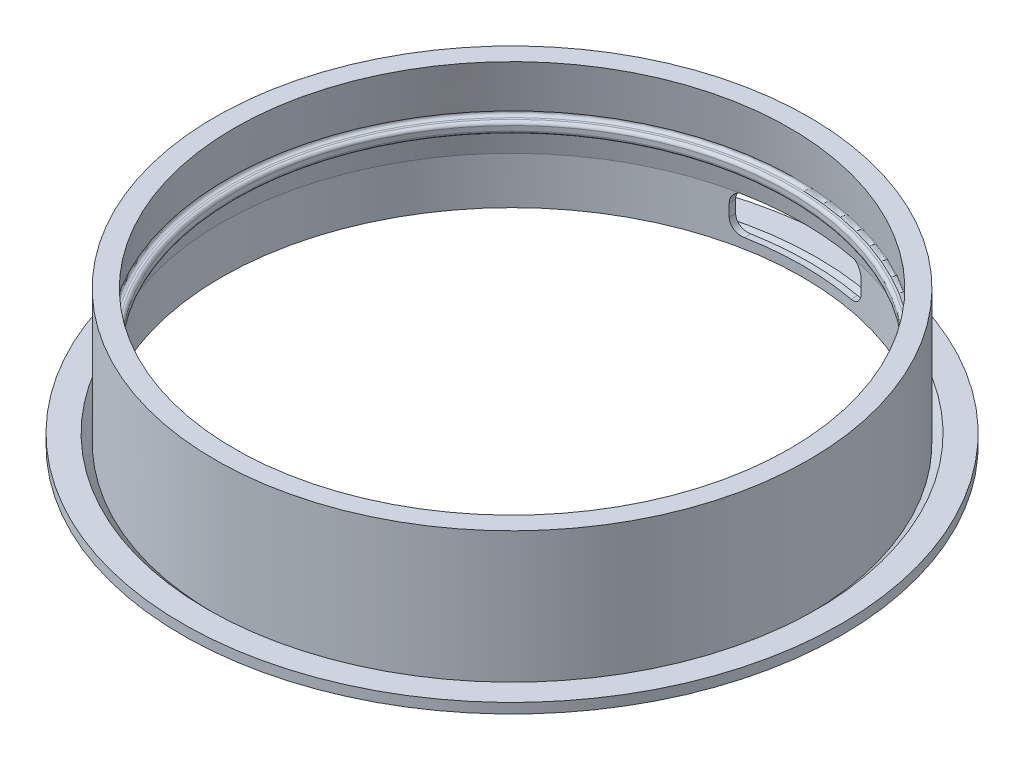
ISO-10303-21;
HEADER;
FILE_DESCRIPTION(('STEP AP214'),'2;1');
FILE_NAME('part.step','',(''),(''),'','','');
FILE_SCHEMA(('AUTOMOTIVE_DESIGN { 1 0 10303 214 1 1 1 1 }'));
ENDSEC;
DATA;
#1=APPLICATION_CONTEXT('core data for automotive mechanical design processes');
#2=APPLICATION_PROTOCOL_DEFINITION('international standard','automotive_design',2000,#1);
#3=PRODUCT_CONTEXT('',#1,'mechanical');
#4=PRODUCT('Part','Part','',(#3));
#5=PRODUCT_RELATED_PRODUCT_CATEGORY('part','',(#4));
#6=PRODUCT_DEFINITION_FORMATION('','',#4);
#7=PRODUCT_DEFINITION_CONTEXT('part definition',#1,'design');
#8=PRODUCT_DEFINITION('design','',#6,#7);
#9=PRODUCT_DEFINITION_SHAPE('','',#8);
#10=(LENGTH_UNIT() NAMED_UNIT(*) SI_UNIT(.MILLI.,.METRE.));
#11=(NAMED_UNIT(*) PLANE_ANGLE_UNIT() SI_UNIT($,.RADIAN.));
#12=(NAMED_UNIT(*) SI_UNIT($,.STERADIAN.) SOLID_ANGLE_UNIT());
#13=UNCERTAINTY_MEASURE_WITH_UNIT(LENGTH_MEASURE(1.E-05),#10,'distance_accuracy_value','');
#14=(GEOMETRIC_REPRESENTATION_CONTEXT(3) GLOBAL_UNCERTAINTY_ASSIGNED_CONTEXT((#13)) GLOBAL_UNIT_ASSIGNED_CONTEXT((#10,
#11,#12)) REPRESENTATION_CONTEXT('',''));
#15=CARTESIAN_POINT('',(0.,0.,0.));
#16=DIRECTION('',(0.,0.,1.));
#17=DIRECTION('',(1.,0.,0.));
#18=AXIS2_PLACEMENT_3D('',#15,#16,#17);
#19=CARTESIAN_POINT('',(47.3,1.59999999999999,0.));
#20=DIRECTION('',(0.,1.,0.));
#21=DIRECTION('',(-1.,0.,0.));
#22=AXIS2_PLACEMENT_3D('',#19,#20,#21);
#23=PLANE('',#22);
#24=DIRECTION('',(0.,0.,1.));
#25=VECTOR('',#24,1.);
#26=CARTESIAN_POINT('',(8.50000000000001,1.59999999999986,0.));
#27=LINE('',#26,#25);
#28=CARTESIAN_POINT('',(8.50000000000001,1.60000000000005,-45.5130750444309));
#29=VERTEX_POINT('',#28);
#30=CARTESIAN_POINT('',(8.50000000000001,1.59999999999985,-46.5299903288191));
#31=VERTEX_POINT('',#30);
#32=EDGE_CURVE('E113',#29,#31,#27,.F.);
#33=ORIENTED_EDGE('',*,*,#32,.T.);
#34=CARTESIAN_POINT('',(0.,1.6,0.));
#35=DIRECTION('',(0.,-1.,0.));
#36=DIRECTION('',(0.,0.,-1.));
#37=AXIS2_PLACEMENT_3D('',#34,#35,#36);
#38=CIRCLE('',#37,47.3000000000001);
#39=CARTESIAN_POINT('',(-8.5,1.6,-46.5299903288192));
#40=VERTEX_POINT('',#39);
#41=EDGE_CURVE('E106',#40,#31,#38,.T.);
#42=ORIENTED_EDGE('',*,*,#41,.F.);
#43=DIRECTION('',(0.,0.,1.));
#44=VECTOR('',#43,1.);
#45=CARTESIAN_POINT('',(-8.49999999999999,1.5999999999998,0.));
#46=LINE('',#45,#44);
#47=CARTESIAN_POINT('',(-8.49999999999999,1.60000000000005,-45.513075044431));
#48=VERTEX_POINT('',#47);
#49=EDGE_CURVE('E110',#40,#48,#46,.T.);
#50=ORIENTED_EDGE('',*,*,#49,.T.);
#51=CARTESIAN_POINT('',(0.,1.60000000000005,0.));
#52=DIRECTION('',(0.,-1.,0.));
#53=DIRECTION('',(1.,0.,0.));
#54=AXIS2_PLACEMENT_3D('',#51,#52,#53);
#55=CIRCLE('',#54,46.3);
#56=EDGE_CURVE('E511',#29,#48,#55,.F.);
#57=ORIENTED_EDGE('',*,*,#56,.F.);
#58=EDGE_LOOP('',(#33,#42,#50,#57));
#59=FACE_BOUND('',#58,.T.);
#60=ADVANCED_FACE('F35',(#59),#23,.T.);
#61=CARTESIAN_POINT('',(3.43024899888577E-12,-1000.,0.));
#62=DIRECTION('',(0.,-1.,0.));
#63=DIRECTION('',(1.,0.,0.));
#64=AXIS2_PLACEMENT_3D('',#61,#62,#63);
#65=CYLINDRICAL_SURFACE('',#64,46.3);
#66=CARTESIAN_POINT('',(0.,-1.11022302462516E-13,0.));
#67=DIRECTION('',(0.,-1.,0.));
#68=DIRECTION('',(1.,0.,0.));
#69=AXIS2_PLACEMENT_3D('',#66,#67,#68);
#70=CIRCLE('',#69,46.3);
#71=CARTESIAN_POINT('',(46.3,0.,0.));
#72=VERTEX_POINT('',#71);
#73=EDGE_CURVE('E531',#72,#72,#70,.T.);
#74=ORIENTED_EDGE('',*,*,#73,.T.);
#75=EDGE_LOOP('',(#74));
#76=FACE_BOUND('',#75,.T.);
#77=CARTESIAN_POINT('',(-10.5,5.6,-45.0936802667506));
#78=CARTESIAN_POINT('',(-10.5000004104109,5.65526649087846,-45.0936795736649));
#79=CARTESIAN_POINT('',(-10.4977077190256,5.7105060555035,-45.094214086322));
#80=CARTESIAN_POINT('',(-10.4885664548555,5.82058035333635,-45.0963413854431));
#81=CARTESIAN_POINT('',(-10.4817183802295,5.87541513014727,-45.097934056191));
#82=CARTESIAN_POINT('',(-10.4544303376453,6.03853785024145,-45.1042709372307));
#83=CARTESIAN_POINT('',(-10.4272462049723,6.14571769373603,-45.1105741435007));
#84=CARTESIAN_POINT('',(-10.3557605619696,6.35384369708262,-45.1270379133283));
#85=CARTESIAN_POINT('',(-10.3114559281232,6.45478871553405,-45.1371991807563));
#86=CARTESIAN_POINT('',(-10.2071093088741,6.64776185478804,-45.1609097744737));
#87=CARTESIAN_POINT('',(-10.1470663151222,6.73978940373497,-45.1744593178456));
#88=CARTESIAN_POINT('',(-10.0121874072757,6.91359965426659,-45.2045453775855));
#89=CARTESIAN_POINT('',(-9.93717567467599,6.99523964337688,-45.2211171715226));
#90=CARTESIAN_POINT('',(-9.77499612568789,7.14484949242155,-45.2564506721741));
#91=CARTESIAN_POINT('',(-9.6878251879712,7.21281583128583,-45.2752129409922));
#92=CARTESIAN_POINT('',(-9.50154931274933,7.33481710318538,-45.3146756268316));
#93=CARTESIAN_POINT('',(-9.40220982252247,7.38848218898965,-45.3354115307399));
#94=CARTESIAN_POINT('',(-9.19608906305918,7.4783203253953,-45.3776706493196));
#95=CARTESIAN_POINT('',(-9.08931057261664,7.51449986795624,-45.3991935685939));
#96=CARTESIAN_POINT('',(-8.90179675352576,7.5608950881171,-45.4362676883281));
#97=CARTESIAN_POINT('',(-8.82212520435228,7.57554152947498,-45.4518063776837));
#98=CARTESIAN_POINT('',(-8.66166009921809,7.59509466135875,-45.4826604171018));
#99=CARTESIAN_POINT('',(-8.58086809265328,7.60001366803208,-45.4979760251795));
#100=CARTESIAN_POINT('',(-8.5,7.6,-45.513075044431));
#101=B_SPLINE_CURVE_WITH_KNOTS('',3,(#77,#78,#79,#80,#81,#82,#83,#84,#85,#86,#87,#88,#89,#90,
#91,#92,#93,#94,#95,#96,#97,#98,#99,#100),.UNSPECIFIED.,.F.,.F.,(4,2,2,2,2,2,2,2,2,2,2,4),(0.,
0.165696119068076,0.331374121241239,0.661920187394013,0.992526587877508,1.32315417533432,
1.65792179006111,1.99277549999301,2.33559445459214,2.67828603083432,2.92518226759243,
3.17176570221575),.UNSPECIFIED.);
#102=CARTESIAN_POINT('',(-10.5000000000035,5.60000000000005,-45.0936802667506));
#103=VERTEX_POINT('',#102);
#104=CARTESIAN_POINT('',(-9.12449979983976,7.50000000000004,-45.3919982309958));
#105=VERTEX_POINT('',#104);
#106=EDGE_CURVE('E186',#103,#105,#101,.T.);
#107=ORIENTED_EDGE('',*,*,#106,.T.);
#108=CARTESIAN_POINT('',(0.,7.50000000000006,0.));
#109=DIRECTION('',(0.,-1.,0.));
#110=DIRECTION('',(1.,0.,0.));
#111=AXIS2_PLACEMENT_3D('',#108,#109,#110);
#112=CIRCLE('',#111,46.3000000000001);
#113=CARTESIAN_POINT('',(9.12449979983956,7.5000000000001,-45.3919982309959));
#114=VERTEX_POINT('',#113);
#115=EDGE_CURVE('E50',#114,#105,#112,.T.);
#116=ORIENTED_EDGE('',*,*,#115,.F.);
#117=CARTESIAN_POINT('',(8.5,7.6,-45.5130750444309));
#118=CARTESIAN_POINT('',(8.55725814141848,7.59999911370923,-45.5023821645604));
#119=CARTESIAN_POINT('',(8.61446784015599,7.59753969833357,-45.4915851243363));
#120=CARTESIAN_POINT('',(8.72843797955417,7.58773514770107,-45.4698551552103));
#121=CARTESIAN_POINT('',(8.78519844317114,7.58039026374855,-45.4589222333263));
#122=CARTESIAN_POINT('',(8.95413884527806,7.5510996006173,-45.4260553035093));
#123=CARTESIAN_POINT('',(9.0651294420343,7.52189762790166,-45.4040247761624));
#124=CARTESIAN_POINT('',(9.28058443687315,7.44493846832502,-45.3604769979874));
#125=CARTESIAN_POINT('',(9.38504575350412,7.39717259596863,-45.3389599924298));
#126=CARTESIAN_POINT('',(9.58445939191577,7.28435716649275,-45.2972241427976));
#127=CARTESIAN_POINT('',(9.679413830236,7.21931146825695,-45.2770050101357));
#128=CARTESIAN_POINT('',(9.85663852416251,7.07397782900395,-45.238754161388));
#129=CARTESIAN_POINT('',(9.93896207354822,6.99375730841239,-45.2207133271641));
#130=CARTESIAN_POINT('',(10.0889193713626,6.82003953795676,-45.1874940703667));
#131=CARTESIAN_POINT('',(10.1565512654013,6.72654061454467,-45.1723160091661));
#132=CARTESIAN_POINT('',(10.2737927715804,6.53082281538272,-45.1457942639334));
#133=CARTESIAN_POINT('',(10.3237204520179,6.42880341953919,-45.1343831933545));
#134=CARTESIAN_POINT('',(10.4056491521351,6.2175030499746,-45.1155654830007));
#135=CARTESIAN_POINT('',(10.4376671458512,6.10822906212921,-45.1081550518236));
#136=CARTESIAN_POINT('',(10.4734274796726,5.93171903273268,-45.099861350266));
#137=CARTESIAN_POINT('',(10.4833858570636,5.86574616555138,-45.0975464701491));
#138=CARTESIAN_POINT('',(10.4966703603771,5.73319306287905,-45.0944556223757));
#139=CARTESIAN_POINT('',(10.5000056555532,5.66661379546546,-45.0936775271423));
#140=CARTESIAN_POINT('',(10.5,5.60000000000004,-45.0936802667514));
#141=B_SPLINE_CURVE_WITH_KNOTS('',3,(#117,#118,#119,#120,#121,#122,#123,#124,#125,#126,#127,
#128,#129,#130,#131,#132,#133,#134,#135,#136,#137,#138,#139,#140),.UNSPECIFIED.,.F.,.F.,(4,2,2,
2,2,2,2,2,2,2,2,4),(0.,0.174635821586464,0.349262660750496,0.698059388238651,1.0470195041614,
1.39590175667445,1.74326889089933,2.09067984457726,2.43148863990916,2.77197388154683,
2.97193698786964,3.171623063917),.UNSPECIFIED.);
#142=CARTESIAN_POINT('',(10.4999999999968,5.60000000000005,-45.0936802667521));
#143=VERTEX_POINT('',#142);
#144=EDGE_CURVE('E540',#114,#143,#141,.T.);
#145=ORIENTED_EDGE('',*,*,#144,.T.);
#146=DIRECTION('',(0.,-1.,0.));
#147=VECTOR('',#146,1.);
#148=CARTESIAN_POINT('',(10.5000000000003,-1000.,-45.0936802667521));
#149=LINE('',#148,#147);
#150=CARTESIAN_POINT('',(10.4999999999968,3.59999999999983,-45.0936802667521));
#151=VERTEX_POINT('',#150);
#152=EDGE_CURVE('E513',#143,#151,#149,.T.);
#153=ORIENTED_EDGE('',*,*,#152,.T.);
#154=CARTESIAN_POINT('',(10.5,3.59999999999986,-45.0936802667521));
#155=CARTESIAN_POINT('',(10.5000004104109,3.54473350912139,-45.0936795736654));
#156=CARTESIAN_POINT('',(10.4977077190256,3.48949394449634,-45.0942140863221));
#157=CARTESIAN_POINT('',(10.4885664548555,3.37941964666348,-45.0963413854429));
#158=CARTESIAN_POINT('',(10.4817183802295,3.32458486985257,-45.0979340561909));
#159=CARTESIAN_POINT('',(10.4544303376453,3.16146214975839,-45.1042709372308));
#160=CARTESIAN_POINT('',(10.4272462049723,3.05428230626382,-45.1105741435007));
#161=CARTESIAN_POINT('',(10.3557605619696,2.84615630291723,-45.1270379133282));
#162=CARTESIAN_POINT('',(10.3114559281232,2.74521128446581,-45.1371991807563));
#163=CARTESIAN_POINT('',(10.2071093088741,2.55223814521182,-45.1609097744737));
#164=CARTESIAN_POINT('',(10.1470663151222,2.46021059626488,-45.1744593178456));
#165=CARTESIAN_POINT('',(10.0121874072757,2.28640034573326,-45.2045453775855));
#166=CARTESIAN_POINT('',(9.93717567467598,2.20476035662297,-45.2211171715226));
#167=CARTESIAN_POINT('',(9.77499612568787,2.0551505075783,-45.2564506721741));
#168=CARTESIAN_POINT('',(9.68782518797118,1.98718416871402,-45.2752129409922));
#169=CARTESIAN_POINT('',(9.50154931274931,1.86518289681447,-45.3146756268316));
#170=CARTESIAN_POINT('',(9.40220982252245,1.8115178110102,-45.3354115307399));
#171=CARTESIAN_POINT('',(9.19608906305917,1.72167967460456,-45.3776706493196));
#172=CARTESIAN_POINT('',(9.08931057261662,1.68550013204362,-45.3991935685939));
#173=CARTESIAN_POINT('',(8.90179675352575,1.63910491188277,-45.4362676883281));
#174=CARTESIAN_POINT('',(8.82212520435226,1.62445847052488,-45.4518063776837));
#175=CARTESIAN_POINT('',(8.66166009921809,1.60490533864111,-45.4826604171018));
#176=CARTESIAN_POINT('',(8.58086809265329,1.59998633196778,-45.4979760251795));
#177=CARTESIAN_POINT('',(8.50000000000001,1.59999999999986,-45.5130750444309));
#178=B_SPLINE_CURVE_WITH_KNOTS('',3,(#154,#155,#156,#157,#158,#159,#160,#161,#162,#163,#164,
#165,#166,#167,#168,#169,#170,#171,#172,#173,#174,#175,#176,#177),.UNSPECIFIED.,.F.,.F.,(4,2,2,
2,2,2,2,2,2,2,2,4),(0.,0.165696119068094,0.331374121241258,0.661920187394008,0.992526587877502,
1.32315417533433,1.65792179006112,1.99277549999302,2.33559445459214,2.67828603083433,
2.92518226759242,3.17176570221572),.UNSPECIFIED.);
#179=EDGE_CURVE('E149',#151,#29,#178,.T.);
#180=ORIENTED_EDGE('',*,*,#179,.T.);
#181=ORIENTED_EDGE('',*,*,#56,.T.);
#182=CARTESIAN_POINT('',(-8.49999999999999,1.5999999999998,-45.513075044431));
#183=CARTESIAN_POINT('',(-8.55725814141847,1.60000088629058,-45.5023821645604));
#184=CARTESIAN_POINT('',(-8.61446784015599,1.60246030166624,-45.4915851243363));
#185=CARTESIAN_POINT('',(-8.72843797955416,1.61226485229874,-45.4698551552103));
#186=CARTESIAN_POINT('',(-8.78519844317113,1.61960973625126,-45.4589222333263));
#187=CARTESIAN_POINT('',(-8.95413884527806,1.64890039938251,-45.4260553035093));
#188=CARTESIAN_POINT('',(-9.06512944203429,1.67810237209814,-45.4040247761624));
#189=CARTESIAN_POINT('',(-9.28058443687314,1.75506153167478,-45.3604769979874));
#190=CARTESIAN_POINT('',(-9.38504575350411,1.80282740403118,-45.3389599924298));
#191=CARTESIAN_POINT('',(-9.58445939191576,1.91564283350705,-45.2972241427976));
#192=CARTESIAN_POINT('',(-9.679413830236,1.98068853174285,-45.2770050101357));
#193=CARTESIAN_POINT('',(-9.8566385241625,2.12602217099585,-45.238754161388));
#194=CARTESIAN_POINT('',(-9.93896207354821,2.20624269158741,-45.2207133271641));
#195=CARTESIAN_POINT('',(-10.0889193713626,2.37996046204304,-45.1874940703667));
#196=CARTESIAN_POINT('',(-10.1565512654013,2.47345938545513,-45.1723160091661));
#197=CARTESIAN_POINT('',(-10.2737927715804,2.66917718461708,-45.1457942639334));
#198=CARTESIAN_POINT('',(-10.3237204520179,2.77119658046061,-45.1343831933545));
#199=CARTESIAN_POINT('',(-10.4056491521351,2.9824969500252,-45.1155654830007));
#200=CARTESIAN_POINT('',(-10.4376671458512,3.09177093787059,-45.1081550518236));
#201=CARTESIAN_POINT('',(-10.4734274796726,3.26828096726713,-45.099861350266));
#202=CARTESIAN_POINT('',(-10.4833858570636,3.33425383444845,-45.0975464701491));
#203=CARTESIAN_POINT('',(-10.4966703603771,3.46680693712081,-45.0944556223757));
#204=CARTESIAN_POINT('',(-10.5000056555532,3.5333862045344,-45.0936775271423));
#205=CARTESIAN_POINT('',(-10.5,3.59999999999984,-45.0936802667514));
#206=B_SPLINE_CURVE_WITH_KNOTS('',3,(#182,#183,#184,#185,#186,#187,#188,#189,#190,#191,#192,
#193,#194,#195,#196,#197,#198,#199,#200,#201,#202,#203,#204,#205),.UNSPECIFIED.,.F.,.F.,(4,2,2,
2,2,2,2,2,2,2,2,4),(0.,0.174635821586464,0.349262660750496,0.69805938823865,1.0470195041614,
1.39590175667445,1.74326889089932,2.09067984457726,2.43148863990916,2.77197388154683,
2.97193698786968,3.17162306391708),.UNSPECIFIED.);
#207=CARTESIAN_POINT('',(-10.5000000000034,3.59999999999983,-45.0936802667506));
#208=VERTEX_POINT('',#207);
#209=EDGE_CURVE('E128',#48,#208,#206,.T.);
#210=ORIENTED_EDGE('',*,*,#209,.T.);
#211=DIRECTION('',(0.,-1.,0.));
#212=VECTOR('',#211,1.);
#213=CARTESIAN_POINT('',(-10.5,-1000.,-45.0936802667506));
#214=LINE('',#213,#212);
#215=EDGE_CURVE('E508',#208,#103,#214,.F.);
#216=ORIENTED_EDGE('',*,*,#215,.T.);
#217=EDGE_LOOP('',(#107,#116,#145,#153,#180,#181,#210,#216));
#218=FACE_BOUND('',#217,.T.);
#219=ADVANCED_FACE('F168',(#76,#218),#65,.F.);
#220=CARTESIAN_POINT('',(52.5,0.,0.));
#221=DIRECTION('',(0.,-1.,0.));
#222=DIRECTION('',(1.,0.,0.));
#223=AXIS2_PLACEMENT_3D('',#220,#221,#222);
#224=PLANE('',#223);
#225=CARTESIAN_POINT('',(0.,-2.22044604925031E-13,0.));
#226=DIRECTION('',(0.,-1.,0.));
#227=DIRECTION('',(1.,0.,0.));
#228=AXIS2_PLACEMENT_3D('',#225,#226,#227);
#229=CIRCLE('',#228,52.5);
#230=CARTESIAN_POINT('',(52.5,0.,0.));
#231=VERTEX_POINT('',#230);
#232=EDGE_CURVE('E522',#231,#231,#229,.T.);
#233=ORIENTED_EDGE('',*,*,#232,.T.);
#234=EDGE_LOOP('',(#233));
#235=FACE_BOUND('',#234,.T.);
#236=ORIENTED_EDGE('',*,*,#73,.F.);
#237=EDGE_LOOP('',(#236));
#238=FACE_BOUND('',#237,.T.);
#239=ADVANCED_FACE('F172',(#235,#238),#224,.T.);
#240=CARTESIAN_POINT('',(46.3,21.6,0.));
#241=DIRECTION('',(0.,1.,0.));
#242=DIRECTION('',(-1.,0.,0.));
#243=AXIS2_PLACEMENT_3D('',#240,#241,#242);
#244=PLANE('',#243);
#245=CARTESIAN_POINT('',(0.,21.5999999999998,0.));
#246=DIRECTION('',(0.,-1.,0.));
#247=DIRECTION('',(1.,0.,0.));
#248=AXIS2_PLACEMENT_3D('',#245,#246,#247);
#249=CIRCLE('',#248,47.3000000000001);
#250=CARTESIAN_POINT('',(47.3,21.6,0.));
#251=VERTEX_POINT('',#250);
#252=EDGE_CURVE('E528',#251,#251,#249,.T.);
#253=ORIENTED_EDGE('',*,*,#252,.F.);
#254=EDGE_LOOP('',(#253));
#255=FACE_BOUND('',#254,.T.);
#256=CARTESIAN_POINT('',(0.,21.5999999999998,0.));
#257=DIRECTION('',(0.,-1.,0.));
#258=DIRECTION('',(1.,0.,0.));
#259=AXIS2_PLACEMENT_3D('',#256,#257,#258);
#260=CIRCLE('',#259,44.2430324539306);
#261=CARTESIAN_POINT('',(44.2430324539305,21.6,0.));
#262=VERTEX_POINT('',#261);
#263=EDGE_CURVE('E498',#262,#262,#260,.T.);
#264=ORIENTED_EDGE('',*,*,#263,.T.);
#265=EDGE_LOOP('',(#264));
#266=FACE_BOUND('',#265,.T.);
#267=ADVANCED_FACE('F174',(#255,#266),#244,.T.);
#268=CARTESIAN_POINT('',(3.43024899888577E-12,-1000.,0.));
#269=DIRECTION('',(0.,-1.,0.));
#270=DIRECTION('',(1.,0.,0.));
#271=AXIS2_PLACEMENT_3D('',#268,#269,#270);
#272=CYLINDRICAL_SURFACE('',#271,47.3);
#273=CARTESIAN_POINT('',(-10.5,3.5999999999998,-46.1198438852511));
#274=CARTESIAN_POINT('',(-10.5000003781006,3.54469115500207,-46.1198432145675));
#275=CARTESIAN_POINT('',(-10.4977042065435,3.48940923685771,-46.1203666271719));
#276=CARTESIAN_POINT('',(-10.4885488438328,3.37925012597108,-46.1224498026855));
#277=CARTESIAN_POINT('',(-10.4816901396209,3.3243728906704,-46.1240094550008));
#278=CARTESIAN_POINT('',(-10.4543586050192,3.16111950943713,-46.1302152283224));
#279=CARTESIAN_POINT('',(-10.4271300140919,3.05385166851374,-46.1363882877849));
#280=CARTESIAN_POINT('',(-10.3555211399181,2.84555221630837,-46.1525135964819));
#281=CARTESIAN_POINT('',(-10.3111375099058,2.74452182634981,-46.1624665831334));
#282=CARTESIAN_POINT('',(-10.2065961164147,2.55139043041096,-46.1856931555087));
#283=CARTESIAN_POINT('',(-10.1464374994643,2.45928990793131,-46.1989669208943));
#284=CARTESIAN_POINT('',(-10.011323917118,2.28540061326147,-46.2284351577555));
#285=CARTESIAN_POINT('',(-9.936200046647,2.2037488555549,-46.2446627685688));
#286=CARTESIAN_POINT('',(-9.77377478930604,2.05413687243751,-46.2792632828247));
#287=CARTESIAN_POINT('',(-9.68647030292859,1.98618014268773,-46.2976367321077));
#288=CARTESIAN_POINT('',(-9.50000262139563,1.86429114962101,-46.3362623589015));
#289=CARTESIAN_POINT('',(-9.4006145902413,1.81071362700195,-46.3565477992561));
#290=CARTESIAN_POINT('',(-9.19440579981978,1.7210565597491,-46.3978872253711));
#291=CARTESIAN_POINT('',(-9.08758788405317,1.68497036266401,-46.4189409156631));
#292=CARTESIAN_POINT('',(-8.90031648320778,1.63881448292873,-46.4551473887422));
#293=CARTESIAN_POINT('',(-8.82093146486018,1.62427641971708,-46.4702884289028));
#294=CARTESIAN_POINT('',(-8.66105458201475,1.60486858028987,-46.500352978227));
#295=CARTESIAN_POINT('',(-8.58056425590126,1.59998651458121,-46.5152767398699));
#296=CARTESIAN_POINT('',(-8.5,1.5999999999998,-46.5299903288192));
#297=B_SPLINE_CURVE_WITH_KNOTS('',3,(#273,#274,#275,#276,#277,#278,#279,#280,#281,#282,#283,
#284,#285,#286,#287,#288,#289,#290,#291,#292,#293,#294,#295,#296),.UNSPECIFIED.,.F.,.F.,(4,2,2,
2,2,2,2,2,2,2,2,4),(0.,0.165823169554706,0.331628644272355,0.662439986468392,0.993315899041787,
1.32420971663819,1.65907455084516,1.99402475146713,2.33660509174634,2.67905503649066,
2.92484675509682,3.17032544499865),.UNSPECIFIED.);
#298=CARTESIAN_POINT('',(-10.5000000000034,3.59999999999983,-46.1198438852511));
#299=VERTEX_POINT('',#298);
#300=EDGE_CURVE('E120',#299,#40,#297,.T.);
#301=ORIENTED_EDGE('',*,*,#300,.T.);
#302=ORIENTED_EDGE('',*,*,#41,.T.);
#303=CARTESIAN_POINT('',(8.50000000000001,1.59999999999986,-46.5299903288191));
#304=CARTESIAN_POINT('',(8.55721519521034,1.6000008634994,-46.5195389860332));
#305=CARTESIAN_POINT('',(8.61438290727646,1.60245661723587,-46.5089859108734));
#306=CARTESIAN_POINT('',(8.72827116443651,1.61224688353465,-46.4877470949142));
#307=CARTESIAN_POINT('',(8.78499173229826,1.61958114604677,-46.4770613609418));
#308=CARTESIAN_POINT('',(8.9538142634333,1.64882973023119,-46.4449380870026));
#309=CARTESIAN_POINT('',(9.06473027557096,1.67799003127617,-46.4234064515995));
#310=CARTESIAN_POINT('',(9.28004633680688,1.75483916259681,-46.3808454503382));
#311=CARTESIAN_POINT('',(9.38444330466908,1.80253667872022,-46.3598163248478));
#312=CARTESIAN_POINT('',(9.58374095210596,1.91518666138444,-46.3190269246161));
#313=CARTESIAN_POINT('',(9.6786437284198,1.98013530647785,-46.2992663700648));
#314=CARTESIAN_POINT('',(9.85580063065431,2.12525777324984,-46.2618781970105));
#315=CARTESIAN_POINT('',(9.93810564065184,2.20536725645866,-46.2442420627267));
#316=CARTESIAN_POINT('',(10.0880481480493,2.37883587725589,-46.211764580637));
#317=CARTESIAN_POINT('',(10.1556837435063,2.47219673033953,-46.196923595265));
#318=CARTESIAN_POINT('',(10.2730156953669,2.6677002989581,-46.1709725587537));
#319=CARTESIAN_POINT('',(10.3230156894807,2.76965261598304,-46.1597996138923));
#320=CARTESIAN_POINT('',(10.4051021093171,2.98081721020521,-46.1413657784589));
#321=CARTESIAN_POINT('',(10.4372052110421,3.09002262253275,-46.1341012463194));
#322=CARTESIAN_POINT('',(10.4731816240238,3.26675968204466,-46.1259433170591));
#323=CARTESIAN_POINT('',(10.4832321353955,3.33303221096325,-46.1236590273683));
#324=CARTESIAN_POINT('',(10.4966395977057,3.46619230374409,-46.1206089919021));
#325=CARTESIAN_POINT('',(10.5000058092166,3.53307888754651,-46.119841145222));
#326=CARTESIAN_POINT('',(10.5,3.59999999999983,-46.1198438852519));
#327=B_SPLINE_CURVE_WITH_KNOTS('',3,(#303,#304,#305,#306,#307,#308,#309,#310,#311,#312,#313,
#314,#315,#316,#317,#318,#319,#320,#321,#322,#323,#324,#325,#326),.UNSPECIFIED.,.F.,.F.,(4,2,2,
2,2,2,2,2,2,2,2,4),(0.,0.174377713312374,0.348746489503751,0.697022685167776,1.04546226720121,
1.39382472763619,1.74074070139276,2.08770162721303,2.42835801406406,2.76869645060741,
2.96958196715321,3.17018897787325),.UNSPECIFIED.);
#328=CARTESIAN_POINT('',(10.4999999999968,3.59999999999983,-46.1198438852526));
#329=VERTEX_POINT('',#328);
#330=EDGE_CURVE('E157',#31,#329,#327,.T.);
#331=ORIENTED_EDGE('',*,*,#330,.T.);
#332=DIRECTION('',(0.,-1.,0.));
#333=VECTOR('',#332,1.);
#334=CARTESIAN_POINT('',(10.5000000000003,-1000.,-46.1198438852526));
#335=LINE('',#334,#333);
#336=CARTESIAN_POINT('',(10.4999999999968,5.60000000000005,-46.1198438852526));
#337=VERTEX_POINT('',#336);
#338=EDGE_CURVE('E505',#329,#337,#335,.F.);
#339=ORIENTED_EDGE('',*,*,#338,.T.);
#340=CARTESIAN_POINT('',(10.5,5.6,-46.1198438852526));
#341=CARTESIAN_POINT('',(10.5000003781006,5.65530884499776,-46.1198432145681));
#342=CARTESIAN_POINT('',(10.4977042065435,5.71059076314212,-46.120366627172));
#343=CARTESIAN_POINT('',(10.4885488438328,5.82074987402876,-46.1224498026853));
#344=CARTESIAN_POINT('',(10.4816901396209,5.87562710932944,-46.1240094550007));
#345=CARTESIAN_POINT('',(10.4543586050192,6.0388804905627,-46.1302152283225));
#346=CARTESIAN_POINT('',(10.4271300140919,6.14614833148609,-46.1363882877849));
#347=CARTESIAN_POINT('',(10.3555211399181,6.35444778369144,-46.1525135964818));
#348=CARTESIAN_POINT('',(10.3111375099058,6.45547817365001,-46.1624665831334));
#349=CARTESIAN_POINT('',(10.2065961164147,6.64860956958886,-46.1856931555087));
#350=CARTESIAN_POINT('',(10.1464374994643,6.74071009206851,-46.1989669208943));
#351=CARTESIAN_POINT('',(10.011323917118,6.91459938673835,-46.2284351577555));
#352=CARTESIAN_POINT('',(9.93620004664698,6.99625114444492,-46.2446627685688));
#353=CARTESIAN_POINT('',(9.77377478930602,7.14586312756231,-46.2792632828247));
#354=CARTESIAN_POINT('',(9.68647030292857,7.21381985731209,-46.2976367321077));
#355=CARTESIAN_POINT('',(9.50000262139562,7.3357088503788,-46.3362623589015));
#356=CARTESIAN_POINT('',(9.40061459024129,7.38928637299787,-46.3565477992561));
#357=CARTESIAN_POINT('',(9.19440579981976,7.47894344025071,-46.3978872253711));
#358=CARTESIAN_POINT('',(9.08758788405316,7.5150296373358,-46.4189409156631));
#359=CARTESIAN_POINT('',(8.90031648320776,7.56118551707108,-46.4551473887422));
#360=CARTESIAN_POINT('',(8.82093146486017,7.57572358028273,-46.4702884289028));
#361=CARTESIAN_POINT('',(8.66105458201475,7.59513141970994,-46.500352978227));
#362=CARTESIAN_POINT('',(8.58056425590126,7.60001348541859,-46.5152767398699));
#363=CARTESIAN_POINT('',(8.5,7.6,-46.5299903288191));
#364=B_SPLINE_CURVE_WITH_KNOTS('',3,(#340,#341,#342,#343,#344,#345,#346,#347,#348,#349,#350,
#351,#352,#353,#354,#355,#356,#357,#358,#359,#360,#361,#362,#363),.UNSPECIFIED.,.F.,.F.,(4,2,2,
2,2,2,2,2,2,2,2,4),(0.,0.165823169554723,0.331628644272374,0.662439986468388,0.993315899041781,
1.3242097166382,1.65907455084517,1.99402475146713,2.33660509174634,2.67905503649066,
2.92484675509681,3.17032544499864),.UNSPECIFIED.);
#365=CARTESIAN_POINT('',(8.5,7.60000000000005,-46.5299903288191));
#366=VERTEX_POINT('',#365);
#367=EDGE_CURVE('E194',#337,#366,#364,.T.);
#368=ORIENTED_EDGE('',*,*,#367,.T.);
#369=CARTESIAN_POINT('',(0.,7.60000000000005,0.));
#370=DIRECTION('',(0.,1.,0.));
#371=DIRECTION('',(0.,0.,1.));
#372=AXIS2_PLACEMENT_3D('',#369,#370,#371);
#373=CIRCLE('',#372,47.3);
#374=CARTESIAN_POINT('',(-8.5,7.60000000000005,-46.5299903288192));
#375=VERTEX_POINT('',#374);
#376=EDGE_CURVE('E516',#366,#375,#373,.T.);
#377=ORIENTED_EDGE('',*,*,#376,.T.);
#378=CARTESIAN_POINT('',(-8.5,7.6,-46.5299903288191));
#379=CARTESIAN_POINT('',(-8.55721519521033,7.59999913650046,-46.5195389860332));
#380=CARTESIAN_POINT('',(-8.61438290727645,7.597543382764,-46.5089859108734));
#381=CARTESIAN_POINT('',(-8.7282711644365,7.58775311646522,-46.4877470949142));
#382=CARTESIAN_POINT('',(-8.78499173229825,7.58041885395309,-46.4770613609418));
#383=CARTESIAN_POINT('',(-8.95381426343329,7.55117026976868,-46.4449380870026));
#384=CARTESIAN_POINT('',(-9.06473027557095,7.5220099687237,-46.4234064515995));
#385=CARTESIAN_POINT('',(-9.28004633680687,7.44516083740306,-46.3808454503383));
#386=CARTESIAN_POINT('',(-9.38444330466907,7.39746332127965,-46.3598163248478));
#387=CARTESIAN_POINT('',(-9.58374095210596,7.28481333861543,-46.3190269246161));
#388=CARTESIAN_POINT('',(-9.67864372841979,7.21986469352202,-46.2992663700648));
#389=CARTESIAN_POINT('',(-9.85580063065431,7.07474222675003,-46.2618781970106));
#390=CARTESIAN_POINT('',(-9.93810564065183,6.99463274354121,-46.2442420627267));
#391=CARTESIAN_POINT('',(-10.0880481480493,6.82116412274398,-46.211764580637));
#392=CARTESIAN_POINT('',(-10.1556837435063,6.72780326966034,-46.196923595265));
#393=CARTESIAN_POINT('',(-10.2730156953669,6.53229970104177,-46.1709725587537));
#394=CARTESIAN_POINT('',(-10.3230156894807,6.43034738401683,-46.1597996138923));
#395=CARTESIAN_POINT('',(-10.4051021093171,6.21918278979466,-46.1413657784589));
#396=CARTESIAN_POINT('',(-10.4372052110421,6.10997737746712,-46.1341012463194));
#397=CARTESIAN_POINT('',(-10.4731816240238,5.9332403179552,-46.1259433170591));
#398=CARTESIAN_POINT('',(-10.4832321353955,5.86696778903659,-46.1236590273683));
#399=CARTESIAN_POINT('',(-10.4966395977057,5.73380769625573,-46.1206089919021));
#400=CARTESIAN_POINT('',(-10.5000058092167,5.6669211124533,-46.119841145222));
#401=CARTESIAN_POINT('',(-10.5,5.59999999999997,-46.1198438852519));
#402=B_SPLINE_CURVE_WITH_KNOTS('',3,(#378,#379,#380,#381,#382,#383,#384,#385,#386,#387,#388,
#389,#390,#391,#392,#393,#394,#395,#396,#397,#398,#399,#400,#401),.UNSPECIFIED.,.F.,.F.,(4,2,2,
2,2,2,2,2,2,2,2,4),(0.,0.174377713312372,0.348746489503753,0.697022685167777,1.04546226720122,
1.39382472763619,1.74074070139276,2.08770162721304,2.42835801406407,2.76869645060741,
2.96958196715325,3.17018897787333),.UNSPECIFIED.);
#403=CARTESIAN_POINT('',(-10.5000000000035,5.60000000000005,-46.1198438852511));
#404=VERTEX_POINT('',#403);
#405=EDGE_CURVE('E193',#375,#404,#402,.T.);
#406=ORIENTED_EDGE('',*,*,#405,.T.);
#407=DIRECTION('',(0.,-1.,0.));
#408=VECTOR('',#407,1.);
#409=CARTESIAN_POINT('',(-10.5,-1000.,-46.1198438852511));
#410=LINE('',#409,#408);
#411=EDGE_CURVE('E124',#404,#299,#410,.T.);
#412=ORIENTED_EDGE('',*,*,#411,.T.);
#413=EDGE_LOOP('',(#301,#302,#331,#339,#368,#377,#406,#412));
#414=FACE_BOUND('',#413,.T.);
#415=ORIENTED_EDGE('',*,*,#252,.T.);
#416=EDGE_LOOP('',(#415));
#417=FACE_BOUND('',#416,.T.);
#418=CARTESIAN_POINT('',(0.,0.350000000000004,0.));
#419=DIRECTION('',(0.,-1.,0.));
#420=DIRECTION('',(0.,0.,-1.));
#421=AXIS2_PLACEMENT_3D('',#418,#419,#420);
#422=CIRCLE('',#421,47.3000000000001);
#423=CARTESIAN_POINT('',(0.,0.350000000000004,-47.3000000000001));
#424=VERTEX_POINT('',#423);
#425=EDGE_CURVE('E116',#424,#424,#422,.T.);
#426=ORIENTED_EDGE('',*,*,#425,.F.);
#427=EDGE_LOOP('',(#426));
#428=FACE_BOUND('',#427,.T.);
#429=ADVANCED_FACE('F121',(#414,#417,#428),#272,.T.);
#430=CARTESIAN_POINT('',(0.,1.6,0.));
#431=DIRECTION('',(0.,-1.,0.));
#432=DIRECTION('',(0.,0.,-1.));
#433=AXIS2_PLACEMENT_3D('',#430,#431,#432);
#434=CIRCLE('',#433,48.5500000000001);
#435=CARTESIAN_POINT('',(0.,1.6,-48.5500000000001));
#436=VERTEX_POINT('',#435);
#437=EDGE_CURVE('E553',#436,#436,#434,.T.);
#438=ORIENTED_EDGE('',*,*,#437,.T.);
#439=EDGE_LOOP('',(#438));
#440=FACE_BOUND('',#439,.T.);
#441=CARTESIAN_POINT('',(0.,1.59999999999982,0.));
#442=DIRECTION('',(0.,-1.,0.));
#443=DIRECTION('',(1.,0.,0.));
#444=AXIS2_PLACEMENT_3D('',#441,#442,#443);
#445=CIRCLE('',#444,52.5);
#446=CARTESIAN_POINT('',(52.5,1.6,0.));
#447=VERTEX_POINT('',#446);
#448=EDGE_CURVE('E525',#447,#447,#445,.T.);
#449=ORIENTED_EDGE('',*,*,#448,.F.);
#450=EDGE_LOOP('',(#449));
#451=FACE_BOUND('',#450,.T.);
#452=ADVANCED_FACE('F230',(#440,#451),#23,.T.);
#453=CARTESIAN_POINT('',(3.43024899888577E-12,-1000.,0.));
#454=DIRECTION('',(0.,-1.,0.));
#455=DIRECTION('',(1.,0.,0.));
#456=AXIS2_PLACEMENT_3D('',#453,#454,#455);
#457=CYLINDRICAL_SURFACE('',#456,52.5);
#458=ORIENTED_EDGE('',*,*,#448,.T.);
#459=EDGE_LOOP('',(#458));
#460=FACE_BOUND('',#459,.T.);
#461=ORIENTED_EDGE('',*,*,#232,.F.);
#462=EDGE_LOOP('',(#461));
#463=FACE_BOUND('',#462,.T.);
#464=ADVANCED_FACE('F236',(#460,#463),#457,.T.);
#465=CARTESIAN_POINT('',(-10.5,7.6,-52.501));
#466=DIRECTION('',(0.,1.,0.));
#467=DIRECTION('',(0.,0.,1.));
#468=AXIS2_PLACEMENT_3D('',#465,#466,#467);
#469=PLANE('',#468);
#470=ORIENTED_EDGE('',*,*,#376,.F.);
#471=DIRECTION('',(0.,0.,1.));
#472=VECTOR('',#471,1.);
#473=CARTESIAN_POINT('',(8.5,7.6,-45.0936802667514));
#474=LINE('',#473,#472);
#475=CARTESIAN_POINT('',(8.5,7.60000000000005,-45.5130750444309));
#476=VERTEX_POINT('',#475);
#477=EDGE_CURVE('E141',#366,#476,#474,.T.);
#478=ORIENTED_EDGE('',*,*,#477,.T.);
#479=CARTESIAN_POINT('',(0.,7.60000000000005,0.));
#480=DIRECTION('',(0.,1.,0.));
#481=DIRECTION('',(0.,0.,1.));
#482=AXIS2_PLACEMENT_3D('',#479,#480,#481);
#483=CIRCLE('',#482,46.3);
#484=CARTESIAN_POINT('',(-8.5,7.6,-45.513075044431));
#485=VERTEX_POINT('',#484);
#486=EDGE_CURVE('E519',#485,#476,#483,.F.);
#487=ORIENTED_EDGE('',*,*,#486,.F.);
#488=DIRECTION('',(0.,0.,1.));
#489=VECTOR('',#488,1.);
#490=CARTESIAN_POINT('',(-8.5,7.6,-46.1198438852519));
#491=LINE('',#490,#489);
#492=EDGE_CURVE('E133',#485,#375,#491,.F.);
#493=ORIENTED_EDGE('',*,*,#492,.T.);
#494=EDGE_LOOP('',(#470,#478,#487,#493));
#495=FACE_BOUND('',#494,.T.);
#496=ADVANCED_FACE('F240',(#495),#469,.F.);
#497=CARTESIAN_POINT('',(10.5,7.6,-52.501));
#498=DIRECTION('',(1.,0.,0.));
#499=DIRECTION('',(0.,1.,0.));
#500=AXIS2_PLACEMENT_3D('',#497,#498,#499);
#501=PLANE('',#500);
#502=ORIENTED_EDGE('',*,*,#338,.F.);
#503=DIRECTION('',(0.,0.,1.));
#504=VECTOR('',#503,1.);
#505=CARTESIAN_POINT('',(10.5,3.59999999999986,-52.501));
#506=LINE('',#505,#504);
#507=EDGE_CURVE('E131',#329,#151,#506,.T.);
#508=ORIENTED_EDGE('',*,*,#507,.T.);
#509=ORIENTED_EDGE('',*,*,#152,.F.);
#510=DIRECTION('',(0.,0.,1.));
#511=VECTOR('',#510,1.);
#512=CARTESIAN_POINT('',(10.5,5.6,-46.1198438852519));
#513=LINE('',#512,#511);
#514=EDGE_CURVE('E136',#143,#337,#513,.F.);
#515=ORIENTED_EDGE('',*,*,#514,.T.);
#516=EDGE_LOOP('',(#502,#508,#509,#515));
#517=FACE_BOUND('',#516,.T.);
#518=ADVANCED_FACE('F242',(#517),#501,.F.);
#519=CARTESIAN_POINT('',(-10.5,7.6,-52.501));
#520=DIRECTION('',(-1.,0.,0.));
#521=DIRECTION('',(0.,0.,1.));
#522=AXIS2_PLACEMENT_3D('',#519,#520,#521);
#523=PLANE('',#522);
#524=ORIENTED_EDGE('',*,*,#411,.F.);
#525=DIRECTION('',(0.,0.,1.));
#526=VECTOR('',#525,1.);
#527=CARTESIAN_POINT('',(-10.5,5.6,-45.0936802667506));
#528=LINE('',#527,#526);
#529=EDGE_CURVE('E146',#404,#103,#528,.T.);
#530=ORIENTED_EDGE('',*,*,#529,.T.);
#531=ORIENTED_EDGE('',*,*,#215,.F.);
#532=DIRECTION('',(0.,0.,1.));
#533=VECTOR('',#532,1.);
#534=CARTESIAN_POINT('',(-10.5,3.5999999999998,-52.501));
#535=LINE('',#534,#533);
#536=EDGE_CURVE('E144',#208,#299,#535,.F.);
#537=ORIENTED_EDGE('',*,*,#536,.T.);
#538=EDGE_LOOP('',(#524,#530,#531,#537));
#539=FACE_BOUND('',#538,.T.);
#540=ADVANCED_FACE('F245',(#539),#523,.F.);
#541=CARTESIAN_POINT('',(8.5,3.59999999999986,-52.501));
#542=DIRECTION('',(0.,0.,1.));
#543=DIRECTION('',(1.,0.,0.));
#544=AXIS2_PLACEMENT_3D('',#541,#542,#543);
#545=CYLINDRICAL_SURFACE('',#544,2.);
#546=ORIENTED_EDGE('',*,*,#330,.F.);
#547=ORIENTED_EDGE('',*,*,#32,.F.);
#548=ORIENTED_EDGE('',*,*,#179,.F.);
#549=ORIENTED_EDGE('',*,*,#507,.F.);
#550=EDGE_LOOP('',(#546,#547,#548,#549));
#551=FACE_BOUND('',#550,.T.);
#552=ADVANCED_FACE('F164',(#551),#545,.F.);
#553=CARTESIAN_POINT('',(8.5,5.6,-52.501));
#554=DIRECTION('',(0.,0.,-1.));
#555=DIRECTION('',(-1.,0.,0.));
#556=AXIS2_PLACEMENT_3D('',#553,#554,#555);
#557=CYLINDRICAL_SURFACE('',#556,2.);
#558=ORIENTED_EDGE('',*,*,#367,.F.);
#559=ORIENTED_EDGE('',*,*,#514,.F.);
#560=ORIENTED_EDGE('',*,*,#144,.F.);
#561=EDGE_CURVE('E179',#476,#114,#141,.T.);
#562=ORIENTED_EDGE('',*,*,#561,.F.);
#563=ORIENTED_EDGE('',*,*,#477,.F.);
#564=EDGE_LOOP('',(#558,#559,#560,#562,#563));
#565=FACE_BOUND('',#564,.T.);
#566=ADVANCED_FACE('F207',(#565),#557,.F.);
#567=CARTESIAN_POINT('',(-8.5,5.6,-52.501));
#568=DIRECTION('',(0.,0.,-1.));
#569=DIRECTION('',(-1.,0.,0.));
#570=AXIS2_PLACEMENT_3D('',#567,#568,#569);
#571=CYLINDRICAL_SURFACE('',#570,2.);
#572=ORIENTED_EDGE('',*,*,#405,.F.);
#573=ORIENTED_EDGE('',*,*,#492,.F.);
#574=EDGE_CURVE('E58',#105,#485,#101,.T.);
#575=ORIENTED_EDGE('',*,*,#574,.F.);
#576=ORIENTED_EDGE('',*,*,#106,.F.);
#577=ORIENTED_EDGE('',*,*,#529,.F.);
#578=EDGE_LOOP('',(#572,#573,#575,#576,#577));
#579=FACE_BOUND('',#578,.T.);
#580=ADVANCED_FACE('F203',(#579),#571,.F.);
#581=CARTESIAN_POINT('',(-8.5,3.5999999999998,0.));
#582=DIRECTION('',(0.,0.,1.));
#583=DIRECTION('',(1.,0.,0.));
#584=AXIS2_PLACEMENT_3D('',#581,#582,#583);
#585=CYLINDRICAL_SURFACE('',#584,2.);
#586=ORIENTED_EDGE('',*,*,#300,.F.);
#587=ORIENTED_EDGE('',*,*,#536,.F.);
#588=ORIENTED_EDGE('',*,*,#209,.F.);
#589=ORIENTED_EDGE('',*,*,#49,.F.);
#590=EDGE_LOOP('',(#586,#587,#588,#589));
#591=FACE_BOUND('',#590,.T.);
#592=ADVANCED_FACE('F130',(#591),#585,.F.);
#593=CARTESIAN_POINT('',(3.43024899888577E-12,-1000.,0.));
#594=DIRECTION('',(0.,-1.,0.));
#595=DIRECTION('',(1.,0.,0.));
#596=AXIS2_PLACEMENT_3D('',#593,#594,#595);
#597=CYLINDRICAL_SURFACE('',#596,46.3000000000001);
#598=ORIENTED_EDGE('',*,*,#486,.T.);
#599=ORIENTED_EDGE('',*,*,#561,.T.);
#600=EDGE_CURVE('E496',#105,#114,#112,.T.);
#601=ORIENTED_EDGE('',*,*,#600,.F.);
#602=ORIENTED_EDGE('',*,*,#574,.T.);
#603=EDGE_LOOP('',(#598,#599,#601,#602));
#604=FACE_BOUND('',#603,.T.);
#605=ADVANCED_FACE('F213',(#604),#597,.T.);
#606=CARTESIAN_POINT('',(0.,7.50000000000006,0.));
#607=DIRECTION('',(0.,-1.,0.));
#608=DIRECTION('',(1.,0.,0.));
#609=AXIS2_PLACEMENT_3D('',#606,#607,#608);
#610=CONICAL_SURFACE('',#609,46.3000000000001,0.144862327915527);
#611=CARTESIAN_POINT('',(0.,11.2721781005004,0.));
#612=DIRECTION('',(0.,-1.,0.));
#613=DIRECTION('',(1.,0.,0.));
#614=AXIS2_PLACEMENT_3D('',#611,#612,#613);
#615=CIRCLE('',#614,45.7496987283176);
#616=CARTESIAN_POINT('',(45.7496987283175,11.2721781005005,0.));
#617=VERTEX_POINT('',#616);
#618=EDGE_CURVE('E476',#617,#617,#615,.F.);
#619=ORIENTED_EDGE('',*,*,#618,.T.);
#620=EDGE_LOOP('',(#619));
#621=FACE_BOUND('',#620,.T.);
#622=ORIENTED_EDGE('',*,*,#600,.T.);
#623=ORIENTED_EDGE('',*,*,#115,.T.);
#624=EDGE_LOOP('',(#622,#623));
#625=FACE_BOUND('',#624,.T.);
#626=ADVANCED_FACE('F253',(#621,#625),#610,.F.);
#627=CARTESIAN_POINT('',(0.,11.6999999999999,0.));
#628=DIRECTION('',(0.,1.,0.));
#629=DIRECTION('',(-1.,0.,0.));
#630=AXIS2_PLACEMENT_3D('',#627,#628,#629);
#631=PLANE('',#630);
#632=CARTESIAN_POINT('',(0.,11.6999999999999,0.));
#633=DIRECTION('',(0.,1.,0.));
#634=DIRECTION('',(-1.,0.,0.));
#635=AXIS2_PLACEMENT_3D('',#632,#633,#634);
#636=CIRCLE('',#635,45.2549358337831);
#637=CARTESIAN_POINT('',(-45.2549358337832,11.6999999999997,0.));
#638=VERTEX_POINT('',#637);
#639=EDGE_CURVE('E478',#638,#638,#636,.F.);
#640=ORIENTED_EDGE('',*,*,#639,.T.);
#641=EDGE_LOOP('',(#640));
#642=FACE_BOUND('',#641,.T.);
#643=CARTESIAN_POINT('',(0.,11.6999999999999,0.));
#644=DIRECTION('',(0.,1.,0.));
#645=DIRECTION('',(-1.,0.,0.));
#646=AXIS2_PLACEMENT_3D('',#643,#644,#645);
#647=CIRCLE('',#646,44.5);
#648=CARTESIAN_POINT('',(-44.5,11.6999999999997,0.));
#649=VERTEX_POINT('',#648);
#650=EDGE_CURVE('E127',#649,#649,#647,.T.);
#651=ORIENTED_EDGE('',*,*,#650,.T.);
#652=EDGE_LOOP('',(#651));
#653=FACE_BOUND('',#652,.T.);
#654=ADVANCED_FACE('F256',(#642,#653),#631,.F.);
#655=CARTESIAN_POINT('',(3.43024899888577E-12,-1000.,0.));
#656=DIRECTION('',(0.,-1.,0.));
#657=DIRECTION('',(1.,0.,0.));
#658=AXIS2_PLACEMENT_3D('',#655,#656,#657);
#659=CYLINDRICAL_SURFACE('',#658,44.);
#660=CARTESIAN_POINT('',(0.,12.2,0.));
#661=DIRECTION('',(0.,1.,0.));
#662=DIRECTION('',(-1.,0.,0.));
#663=AXIS2_PLACEMENT_3D('',#660,#661,#662);
#664=CIRCLE('',#663,44.);
#665=CARTESIAN_POINT('',(-44.,12.1999999999998,0.));
#666=VERTEX_POINT('',#665);
#667=EDGE_CURVE('E467',#666,#666,#664,.F.);
#668=ORIENTED_EDGE('',*,*,#667,.T.);
#669=EDGE_LOOP('',(#668));
#670=FACE_BOUND('',#669,.T.);
#671=CARTESIAN_POINT('',(0.,12.9499999999998,0.));
#672=DIRECTION('',(0.,-1.,0.));
#673=DIRECTION('',(1.,0.,0.));
#674=AXIS2_PLACEMENT_3D('',#671,#672,#673);
#675=CIRCLE('',#674,44.);
#676=CARTESIAN_POINT('',(43.9999999999999,12.9499999999999,0.));
#677=VERTEX_POINT('',#676);
#678=EDGE_CURVE('E471',#677,#677,#675,.F.);
#679=ORIENTED_EDGE('',*,*,#678,.T.);
#680=EDGE_LOOP('',(#679));
#681=FACE_BOUND('',#680,.T.);
#682=ADVANCED_FACE('F260',(#670,#681),#659,.F.);
#683=CARTESIAN_POINT('',(0.,13.4499999999999,0.));
#684=DIRECTION('',(0.,-1.,0.));
#685=DIRECTION('',(1.,0.,0.));
#686=AXIS2_PLACEMENT_3D('',#683,#684,#685);
#687=PLANE('',#686);
#688=CARTESIAN_POINT('',(0.,13.4499999999999,0.));
#689=DIRECTION('',(0.,-1.,0.));
#690=DIRECTION('',(1.,0.,0.));
#691=AXIS2_PLACEMENT_3D('',#688,#689,#690);
#692=CIRCLE('',#691,44.853754220188);
#693=CARTESIAN_POINT('',(44.8537542201879,13.45,0.));
#694=VERTEX_POINT('',#693);
#695=EDGE_CURVE('E11',#694,#694,#692,.F.);
#696=ORIENTED_EDGE('',*,*,#695,.T.);
#697=EDGE_LOOP('',(#696));
#698=FACE_BOUND('',#697,.T.);
#699=CARTESIAN_POINT('',(0.,13.4499999999999,0.));
#700=DIRECTION('',(0.,-1.,0.));
#701=DIRECTION('',(1.,0.,0.));
#702=AXIS2_PLACEMENT_3D('',#699,#700,#701);
#703=CIRCLE('',#702,44.5);
#704=CARTESIAN_POINT('',(44.4999999999999,13.45,0.));
#705=VERTEX_POINT('',#704);
#706=EDGE_CURVE('E43',#705,#705,#703,.T.);
#707=ORIENTED_EDGE('',*,*,#706,.T.);
#708=EDGE_LOOP('',(#707));
#709=FACE_BOUND('',#708,.T.);
#710=ADVANCED_FACE('F264',(#698,#709),#687,.F.);
#711=CARTESIAN_POINT('',(0.,13.45,0.));
#712=DIRECTION('',(0.,-1.,0.));
#713=DIRECTION('',(1.,0.,0.));
#714=AXIS2_PLACEMENT_3D('',#711,#712,#713);
#715=CONICAL_SURFACE('',#714,45.4319888724034,0.144862327915525);
#716=CARTESIAN_POINT('',(0.,14.0221781005004,0.));
#717=DIRECTION('',(0.,-1.,0.));
#718=DIRECTION('',(1.,0.,0.));
#719=AXIS2_PLACEMENT_3D('',#716,#717,#718);
#720=CIRCLE('',#719,45.3485171147225);
#721=CARTESIAN_POINT('',(45.3485171147224,14.0221781005005,0.));
#722=VERTEX_POINT('',#721);
#723=EDGE_CURVE('E466',#722,#722,#720,.T.);
#724=ORIENTED_EDGE('',*,*,#723,.T.);
#725=EDGE_LOOP('',(#724));
#726=FACE_BOUND('',#725,.T.);
#727=ORIENTED_EDGE('',*,*,#263,.F.);
#728=EDGE_LOOP('',(#727));
#729=FACE_BOUND('',#728,.T.);
#730=ADVANCED_FACE('F268',(#726,#729),#715,.F.);
#731=CARTESIAN_POINT('',(0.,11.1999999999999,0.));
#732=DIRECTION('',(0.,1.,0.));
#733=DIRECTION('',(-1.,0.,0.));
#734=AXIS2_PLACEMENT_3D('',#731,#732,#733);
#735=TOROIDAL_SURFACE('',#734,45.2549358337831,0.5);
#736=ORIENTED_EDGE('',*,*,#618,.F.);
#737=EDGE_LOOP('',(#736));
#738=FACE_BOUND('',#737,.T.);
#739=ORIENTED_EDGE('',*,*,#639,.F.);
#740=EDGE_LOOP('',(#739));
#741=FACE_BOUND('',#740,.T.);
#742=ADVANCED_FACE('F214',(#738,#741),#735,.F.);
#743=CARTESIAN_POINT('',(0.,12.2,0.));
#744=DIRECTION('',(0.,1.,0.));
#745=DIRECTION('',(-1.,0.,0.));
#746=AXIS2_PLACEMENT_3D('',#743,#744,#745);
#747=TOROIDAL_SURFACE('',#746,44.5,0.5);
#748=ORIENTED_EDGE('',*,*,#650,.F.);
#749=EDGE_LOOP('',(#748));
#750=FACE_BOUND('',#749,.T.);
#751=ORIENTED_EDGE('',*,*,#667,.F.);
#752=EDGE_LOOP('',(#751));
#753=FACE_BOUND('',#752,.T.);
#754=ADVANCED_FACE('F380',(#750,#753),#747,.T.);
#755=CARTESIAN_POINT('',(0.,13.9499999999999,0.));
#756=DIRECTION('',(0.,-1.,0.));
#757=DIRECTION('',(1.,0.,0.));
#758=AXIS2_PLACEMENT_3D('',#755,#756,#757);
#759=TOROIDAL_SURFACE('',#758,44.853754220188,0.5);
#760=ORIENTED_EDGE('',*,*,#695,.F.);
#761=EDGE_LOOP('',(#760));
#762=FACE_BOUND('',#761,.T.);
#763=ORIENTED_EDGE('',*,*,#723,.F.);
#764=EDGE_LOOP('',(#763));
#765=FACE_BOUND('',#764,.T.);
#766=ADVANCED_FACE('F282',(#762,#765),#759,.F.);
#767=CARTESIAN_POINT('',(0.,12.9499999999998,0.));
#768=DIRECTION('',(0.,-1.,0.));
#769=DIRECTION('',(1.,0.,0.));
#770=AXIS2_PLACEMENT_3D('',#767,#768,#769);
#771=TOROIDAL_SURFACE('',#770,44.5,0.5);
#772=ORIENTED_EDGE('',*,*,#678,.F.);
#773=EDGE_LOOP('',(#772));
#774=FACE_BOUND('',#773,.T.);
#775=ORIENTED_EDGE('',*,*,#706,.F.);
#776=EDGE_LOOP('',(#775));
#777=FACE_BOUND('',#776,.T.);
#778=ADVANCED_FACE('F37',(#774,#777),#771,.T.);
#779=CARTESIAN_POINT('',(0.,1.6,0.));
#780=DIRECTION('',(0.,1.,0.));
#781=DIRECTION('',(0.,0.,1.));
#782=AXIS2_PLACEMENT_3D('',#779,#780,#781);
#783=CONICAL_SURFACE('',#782,48.5500000000001,0.785398163397438);
#784=ORIENTED_EDGE('',*,*,#425,.T.);
#785=EDGE_LOOP('',(#784));
#786=FACE_BOUND('',#785,.T.);
#787=ORIENTED_EDGE('',*,*,#437,.F.);
#788=EDGE_LOOP('',(#787));
#789=FACE_BOUND('',#788,.T.);
#790=ADVANCED_FACE('F276',(#786,#789),#783,.F.);
#791=CLOSED_SHELL('',(#60,#219,#239,#267,#429,#452,#464,#496,#518,#540,#552,#566,#580,#592,#605,
#626,#654,#682,#710,#730,#742,#754,#766,#778,#790));
#792=MANIFOLD_SOLID_BREP('B2',#791);
#793=ADVANCED_BREP_SHAPE_REPRESENTATION('',(#18,#792),#14);
#794=SHAPE_DEFINITION_REPRESENTATION(#9,#793);
ENDSEC;
END-ISO-10303-21;
